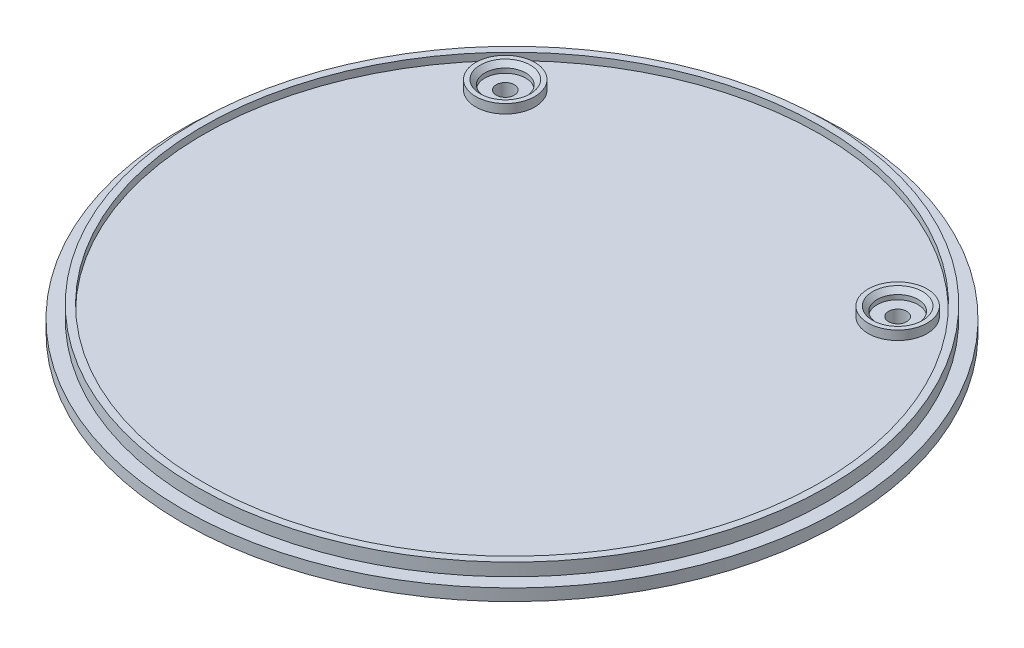
ISO-10303-21;
HEADER;
FILE_DESCRIPTION(('STEP AP214'),'2;1');
FILE_NAME('part.step','',(''),(''),'','','');
FILE_SCHEMA(('AUTOMOTIVE_DESIGN { 1 0 10303 214 1 1 1 1 }'));
ENDSEC;
DATA;
#1=APPLICATION_CONTEXT('core data for automotive mechanical design processes');
#2=APPLICATION_PROTOCOL_DEFINITION('international standard','automotive_design',2000,#1);
#3=PRODUCT_CONTEXT('',#1,'mechanical');
#4=PRODUCT('Part','Part','',(#3));
#5=PRODUCT_RELATED_PRODUCT_CATEGORY('part','',(#4));
#6=PRODUCT_DEFINITION_FORMATION('','',#4);
#7=PRODUCT_DEFINITION_CONTEXT('part definition',#1,'design');
#8=PRODUCT_DEFINITION('design','',#6,#7);
#9=PRODUCT_DEFINITION_SHAPE('','',#8);
#10=(LENGTH_UNIT() NAMED_UNIT(*) SI_UNIT(.MILLI.,.METRE.));
#11=(NAMED_UNIT(*) PLANE_ANGLE_UNIT() SI_UNIT($,.RADIAN.));
#12=(NAMED_UNIT(*) SI_UNIT($,.STERADIAN.) SOLID_ANGLE_UNIT());
#13=UNCERTAINTY_MEASURE_WITH_UNIT(LENGTH_MEASURE(1.E-05),#10,'distance_accuracy_value','');
#14=(GEOMETRIC_REPRESENTATION_CONTEXT(3) GLOBAL_UNCERTAINTY_ASSIGNED_CONTEXT((#13)) GLOBAL_UNIT_ASSIGNED_CONTEXT((#10,
#11,#12)) REPRESENTATION_CONTEXT('',''));
#15=CARTESIAN_POINT('',(0.,0.,0.));
#16=DIRECTION('',(0.,0.,1.));
#17=DIRECTION('',(1.,0.,0.));
#18=AXIS2_PLACEMENT_3D('',#15,#16,#17);
#19=CARTESIAN_POINT('',(-3.34981279583818E-06,-0.654452162270416,0.0664482039365306));
#20=DIRECTION('',(0.,1.,0.));
#21=DIRECTION('',(0.,0.,1.));
#22=AXIS2_PLACEMENT_3D('',#19,#20,#21);
#23=PLANE('',#22);
#24=CARTESIAN_POINT('',(-3.34981279583818E-06,-0.654452162270416,0.0664482039365306));
#25=DIRECTION('',(0.,1.,0.));
#26=DIRECTION('',(0.,0.,1.));
#27=AXIS2_PLACEMENT_3D('',#24,#25,#26);
#28=CIRCLE('',#27,33.);
#29=CARTESIAN_POINT('',(-3.34981279583818E-06,-0.654452162270416,33.0664482039365));
#30=VERTEX_POINT('',#29);
#31=EDGE_CURVE('E146',#30,#30,#28,.T.);
#32=ORIENTED_EDGE('',*,*,#31,.F.);
#33=EDGE_LOOP('',(#32));
#34=FACE_BOUND('',#33,.T.);
#35=ADVANCED_FACE('F34',(#34),#23,.F.);
#36=CARTESIAN_POINT('',(-3.34981279583818E-06,-1.65445216227042,0.0664482039365306));
#37=DIRECTION('',(0.,1.,0.));
#38=DIRECTION('',(0.,0.,1.));
#39=AXIS2_PLACEMENT_3D('',#36,#37,#38);
#40=CYLINDRICAL_SURFACE('',#39,33.);
#41=CARTESIAN_POINT('',(-3.34981279583818E-06,-1.65445216227031,0.0664482039365306));
#42=DIRECTION('',(0.,-1.,0.));
#43=DIRECTION('',(0.,0.,-1.));
#44=AXIS2_PLACEMENT_3D('',#41,#42,#43);
#45=CIRCLE('',#44,33.);
#46=CARTESIAN_POINT('',(-3.34981279583818E-06,-1.65445216227042,-32.9335517960635));
#47=VERTEX_POINT('',#46);
#48=EDGE_CURVE('E87',#47,#47,#45,.F.);
#49=ORIENTED_EDGE('',*,*,#48,.F.);
#50=EDGE_LOOP('',(#49));
#51=FACE_BOUND('',#50,.T.);
#52=ORIENTED_EDGE('',*,*,#31,.T.);
#53=EDGE_LOOP('',(#52));
#54=FACE_BOUND('',#53,.T.);
#55=ADVANCED_FACE('F131',(#51,#54),#40,.F.);
#56=CARTESIAN_POINT('',(-3.35033781592562E-06,-1.11936322633818,-68.4501471784258));
#57=CARTESIAN_POINT('',(-3.35033781590829E-06,-1.338600230619,-68.73318093391));
#58=CARTESIAN_POINT('',(-3.35033781588755E-06,-1.45445216243666,-69.071930547465));
#59=CARTESIAN_POINT('',(-3.35033781586563E-06,-1.45445216227041,-69.4299430762815));
#60=(BOUNDED_CURVE() B_SPLINE_CURVE(3,(#56,#57,#58,#59),.UNSPECIFIED.,.F.,
.F.) B_SPLINE_CURVE_WITH_KNOTS((4,4),(0.,1.),
.UNSPECIFIED.) CURVE() GEOMETRIC_REPRESENTATION_ITEM() RATIONAL_B_SPLINE_CURVE((1.,
0.964129904654601,0.964129904654601,1.)) REPRESENTATION_ITEM(''));
#61=CARTESIAN_POINT('',(-3.34981279583818E-06,0.145547837729584,0.0664482039365306));
#62=DIRECTION('',(0.,-1.,0.));
#63=AXIS1_PLACEMENT('',#61,#62);
#64=SURFACE_OF_REVOLUTION('',#60,#63);
#65=CARTESIAN_POINT('',(-3.34981279583818E-06,-1.11936322629599,0.0664482039365306));
#66=DIRECTION('',(0.,-1.,0.));
#67=DIRECTION('',(0.,0.,-1.));
#68=AXIS2_PLACEMENT_3D('',#65,#66,#67);
#69=CIRCLE('',#68,68.5165953820329);
#70=CARTESIAN_POINT('',(-3.34981279583818E-06,-1.1193632262959,-68.4501471780963));
#71=VERTEX_POINT('',#70);
#72=EDGE_CURVE('E144',#71,#71,#69,.T.);
#73=ORIENTED_EDGE('',*,*,#72,.F.);
#74=EDGE_LOOP('',(#73));
#75=FACE_BOUND('',#74,.T.);
#76=CARTESIAN_POINT('',(-3.34981279583818E-06,-1.45445216227041,0.0664482039365306));
#77=DIRECTION('',(0.,-1.,0.));
#78=DIRECTION('',(-7.55463726655256E-12,0.,-1.));
#79=AXIS2_PLACEMENT_3D('',#76,#77,#78);
#80=CIRCLE('',#79,69.4963912797375);
#81=CARTESIAN_POINT('',(-3.34949758373782E-06,-1.45445216227042,69.5628394837791));
#82=VERTEX_POINT('',#81);
#83=CARTESIAN_POINT('',(-3.35012799579841E-06,-1.45445216227042,-69.429943075906));
#84=VERTEX_POINT('',#83);
#85=EDGE_CURVE('E76',#82,#84,#80,.F.);
#86=ORIENTED_EDGE('',*,*,#85,.F.);
#87=CARTESIAN_POINT('',(-3.34981279583818E-06,-1.45445216227041,0.0664482039365306));
#88=DIRECTION('',(0.,-1.,0.));
#89=DIRECTION('',(7.55475973123465E-12,0.,1.));
#90=AXIS2_PLACEMENT_3D('',#87,#88,#89);
#91=CIRCLE('',#90,69.4963912797375);
#92=EDGE_CURVE('E74',#84,#82,#91,.F.);
#93=ORIENTED_EDGE('',*,*,#92,.F.);
#94=EDGE_LOOP('',(#86,#93));
#95=FACE_BOUND('',#94,.T.);
#96=ADVANCED_FACE('F78',(#75,#95),#64,.F.);
#97=CARTESIAN_POINT('',(-3.34981279583818E-06,-0.928245010270416,0.0664482039365306));
#98=DIRECTION('',(0.,-1.,0.));
#99=DIRECTION('',(0.,0.,-1.));
#100=AXIS2_PLACEMENT_3D('',#97,#98,#99);
#101=CONICAL_SURFACE('',#100,68.269862828,0.91173828722413);
#102=ORIENTED_EDGE('',*,*,#72,.T.);
#103=EDGE_LOOP('',(#102));
#104=FACE_BOUND('',#103,.T.);
#105=CARTESIAN_POINT('',(-3.34981279583818E-06,-0.928245011376177,0.0664482039365306));
#106=DIRECTION('',(0.,1.,0.));
#107=DIRECTION('',(-8.24364362223133E-12,0.,1.));
#108=AXIS2_PLACEMENT_3D('',#105,#106,#107);
#109=CIRCLE('',#108,68.2698628277938);
#110=CARTESIAN_POINT('',(-3.35037558825747E-06,-0.928245011376177,68.3363110317303));
#111=VERTEX_POINT('',#110);
#112=EDGE_CURVE('E81',#111,#111,#109,.F.);
#113=ORIENTED_EDGE('',*,*,#112,.F.);
#114=EDGE_LOOP('',(#113));
#115=FACE_BOUND('',#114,.T.);
#116=ADVANCED_FACE('F130',(#104,#115),#101,.F.);
#117=CARTESIAN_POINT('',(-3.34981279583818E-06,-1.65445216227042,0.0664482039365306));
#118=DIRECTION('',(0.,-1.,0.));
#119=DIRECTION('',(0.,0.,-1.));
#120=AXIS2_PLACEMENT_3D('',#117,#118,#119);
#121=CONICAL_SURFACE('',#120,33.,0.785398163397449);
#122=ORIENTED_EDGE('',*,*,#48,.T.);
#123=EDGE_LOOP('',(#122));
#124=FACE_BOUND('',#123,.T.);
#125=CARTESIAN_POINT('',(-3.34981279583818E-06,-3.65445216227053,0.0664482039365306));
#126=DIRECTION('',(0.,-1.,0.));
#127=DIRECTION('',(0.,0.,-1.));
#128=AXIS2_PLACEMENT_3D('',#125,#126,#127);
#129=CIRCLE('',#128,35.0000000000001);
#130=CARTESIAN_POINT('',(-3.34981279583818E-06,-3.65445216227053,-34.9335517960636));
#131=VERTEX_POINT('',#130);
#132=EDGE_CURVE('E121',#131,#131,#129,.F.);
#133=ORIENTED_EDGE('',*,*,#132,.F.);
#134=EDGE_LOOP('',(#133));
#135=FACE_BOUND('',#134,.T.);
#136=ADVANCED_FACE('F108',(#124,#135),#121,.F.);
#137=CARTESIAN_POINT('',(-3.34981279583818E-06,-1.45445216227042,0.0664482039365306));
#138=DIRECTION('',(0.,-1.,0.));
#139=DIRECTION('',(0.,0.,-1.));
#140=AXIS2_PLACEMENT_3D('',#137,#138,#139);
#141=PLANE('',#140);
#142=ORIENTED_EDGE('',*,*,#92,.T.);
#143=ORIENTED_EDGE('',*,*,#85,.T.);
#144=EDGE_LOOP('',(#142,#143));
#145=FACE_BOUND('',#144,.T.);
#146=CARTESIAN_POINT('',(-3.34981279583818E-06,-1.45445216227042,0.0664482039365306));
#147=DIRECTION('',(0.,-1.,0.));
#148=DIRECTION('',(0.,0.,-1.));
#149=AXIS2_PLACEMENT_3D('',#146,#147,#148);
#150=CIRCLE('',#149,72.5);
#151=CARTESIAN_POINT('',(-3.34981279583818E-06,-1.45445216227042,-72.4335517960635));
#152=VERTEX_POINT('',#151);
#153=EDGE_CURVE('E209',#152,#152,#150,.F.);
#154=ORIENTED_EDGE('',*,*,#153,.F.);
#155=EDGE_LOOP('',(#154));
#156=FACE_BOUND('',#155,.T.);
#157=ADVANCED_FACE('F85',(#145,#156),#141,.T.);
#158=CARTESIAN_POINT('',(-3.35037558825747E-06,-0.928245010637319,68.3363110307764));
#159=CARTESIAN_POINT('',(-3.35037558824866E-06,-0.816790401305734,68.1924237488433));
#160=CARTESIAN_POINT('',(-3.35037558824113E-06,-0.682622841913765,68.069441043351));
#161=CARTESIAN_POINT('',(-3.35037558823509E-06,-0.529601740217797,67.9709005832388));
#162=(BOUNDED_CURVE() B_SPLINE_CURVE(3,(#158,#159,#160,#161),.UNSPECIFIED.,.F.,
.F.) B_SPLINE_CURVE_WITH_KNOTS((4,4),(0.,1.),
.UNSPECIFIED.) CURVE() GEOMETRIC_REPRESENTATION_ITEM() RATIONAL_B_SPLINE_CURVE((1.,
0.990411473101553,0.990411473101553,1.)) REPRESENTATION_ITEM(''));
#163=CARTESIAN_POINT('',(-3.34981279583818E-06,0.336666053729584,0.0664482039365306));
#164=DIRECTION('',(0.,1.,0.));
#165=AXIS1_PLACEMENT('',#163,#164);
#166=SURFACE_OF_REVOLUTION('',#162,#165);
#167=CARTESIAN_POINT('',(-3.34981279583818E-06,-0.529601740197338,0.0664482039365306));
#168=DIRECTION('',(0.,-1.,0.));
#169=DIRECTION('',(0.,0.,-1.));
#170=AXIS2_PLACEMENT_3D('',#167,#168,#169);
#171=CIRCLE('',#170,67.9044523795949);
#172=CARTESIAN_POINT('',(-3.34981279586907E-06,-0.529601740197338,-67.8380041756583));
#173=VERTEX_POINT('',#172);
#174=EDGE_CURVE('E212',#173,#173,#171,.T.);
#175=ORIENTED_EDGE('',*,*,#174,.F.);
#176=EDGE_LOOP('',(#175));
#177=FACE_BOUND('',#176,.T.);
#178=ORIENTED_EDGE('',*,*,#112,.T.);
#179=EDGE_LOOP('',(#178));
#180=FACE_BOUND('',#179,.T.);
#181=ADVANCED_FACE('F107',(#177,#180),#166,.F.);
#182=CARTESIAN_POINT('',(-3.34981279583818E-06,-3.65445216227042,0.0664482039365306));
#183=DIRECTION('',(0.,-1.,0.));
#184=DIRECTION('',(0.,0.,-1.));
#185=AXIS2_PLACEMENT_3D('',#182,#183,#184);
#186=PLANE('',#185);
#187=ORIENTED_EDGE('',*,*,#132,.T.);
#188=EDGE_LOOP('',(#187));
#189=FACE_BOUND('',#188,.T.);
#190=CARTESIAN_POINT('',(-3.34981279583818E-06,-3.65445216227042,0.0664482039365306));
#191=DIRECTION('',(0.,1.,0.));
#192=DIRECTION('',(0.,0.,1.));
#193=AXIS2_PLACEMENT_3D('',#190,#191,#192);
#194=CIRCLE('',#193,37.4);
#195=CARTESIAN_POINT('',(-3.3498128942334E-06,-3.65445216227041,37.4664482039366));
#196=VERTEX_POINT('',#195);
#197=CARTESIAN_POINT('',(-3.3498126909443E-06,-3.65445216227041,-37.3335517960635));
#198=VERTEX_POINT('',#197);
#199=EDGE_CURVE('E354',#196,#198,#194,.T.);
#200=ORIENTED_EDGE('',*,*,#199,.F.);
#201=CARTESIAN_POINT('',(-3.34981279583818E-06,-3.65445216227042,0.0664482039365306));
#202=DIRECTION('',(0.,1.,0.));
#203=DIRECTION('',(0.,0.,-1.));
#204=AXIS2_PLACEMENT_3D('',#201,#202,#203);
#205=CIRCLE('',#204,37.4);
#206=EDGE_CURVE('E208',#198,#196,#205,.T.);
#207=ORIENTED_EDGE('',*,*,#206,.F.);
#208=EDGE_LOOP('',(#200,#207));
#209=FACE_BOUND('',#208,.T.);
#210=ADVANCED_FACE('F360',(#189,#209),#186,.T.);
#211=CARTESIAN_POINT('',(-3.34981279583818E-06,-1.45445216227042,0.0664482039365306));
#212=DIRECTION('',(0.,-1.,0.));
#213=DIRECTION('',(0.,0.,-1.));
#214=AXIS2_PLACEMENT_3D('',#211,#212,#213);
#215=CYLINDRICAL_SURFACE('',#214,72.5);
#216=ORIENTED_EDGE('',*,*,#153,.T.);
#217=EDGE_LOOP('',(#216));
#218=FACE_BOUND('',#217,.T.);
#219=CARTESIAN_POINT('',(-3.34981279583818E-06,1.14554783772958,0.0664482039365306));
#220=DIRECTION('',(0.,-1.,0.));
#221=DIRECTION('',(0.,0.,-1.));
#222=AXIS2_PLACEMENT_3D('',#219,#220,#221);
#223=CIRCLE('',#222,72.5);
#224=CARTESIAN_POINT('',(-3.34981279583818E-06,1.14554783772958,-72.4335517960635));
#225=VERTEX_POINT('',#224);
#226=EDGE_CURVE('E204',#225,#225,#223,.F.);
#227=ORIENTED_EDGE('',*,*,#226,.F.);
#228=EDGE_LOOP('',(#227));
#229=FACE_BOUND('',#228,.T.);
#230=ADVANCED_FACE('F368',(#218,#229),#215,.T.);
#231=CARTESIAN_POINT('',(-3.34981279583818E-06,-0.254452162270416,-67.3335517960635));
#232=CARTESIAN_POINT('',(-3.34981279585094E-06,-0.254452162270416,-67.5420619954351));
#233=CARTESIAN_POINT('',(-3.34981279586215E-06,-0.354295963309176,-67.725113132105));
#234=CARTESIAN_POINT('',(-3.34981279586907E-06,-0.529601740433404,-67.8380041758104));
#235=(BOUNDED_CURVE() B_SPLINE_CURVE(3,(#231,#232,#233,#234),.UNSPECIFIED.,.F.,
.F.) B_SPLINE_CURVE_WITH_KNOTS((4,4),(0.,1.),
.UNSPECIFIED.) CURVE() GEOMETRIC_REPRESENTATION_ITEM() RATIONAL_B_SPLINE_CURVE((1.,
0.91860010436426,0.91860010436426,1.)) REPRESENTATION_ITEM(''));
#236=CARTESIAN_POINT('',(-3.34981279583818E-06,-0.854452162270416,0.0664482039365306));
#237=DIRECTION('',(0.,-1.,0.));
#238=AXIS1_PLACEMENT('',#236,#237);
#239=SURFACE_OF_REVOLUTION('',#235,#238);
#240=ORIENTED_EDGE('',*,*,#174,.T.);
#241=EDGE_LOOP('',(#240));
#242=FACE_BOUND('',#241,.T.);
#243=CARTESIAN_POINT('',(-3.34981279583818E-06,-0.254452162270416,0.0664482039365306));
#244=DIRECTION('',(0.,1.,0.));
#245=DIRECTION('',(0.,0.,-1.));
#246=AXIS2_PLACEMENT_3D('',#243,#244,#245);
#247=CIRCLE('',#246,67.4);
#248=CARTESIAN_POINT('',(-3.34981297316006E-06,-0.254452162270415,67.4664482039365));
#249=VERTEX_POINT('',#248);
#250=CARTESIAN_POINT('',(-3.34981260675609E-06,-0.254452162270415,-67.3335517960635));
#251=VERTEX_POINT('',#250);
#252=EDGE_CURVE('E203',#249,#251,#247,.F.);
#253=ORIENTED_EDGE('',*,*,#252,.F.);
#254=CARTESIAN_POINT('',(-3.34981279583818E-06,-0.254452162270416,0.0664482039365306));
#255=DIRECTION('',(0.,1.,0.));
#256=DIRECTION('',(0.,0.,1.));
#257=AXIS2_PLACEMENT_3D('',#254,#255,#256);
#258=CIRCLE('',#257,67.4);
#259=EDGE_CURVE('E207',#251,#249,#258,.F.);
#260=ORIENTED_EDGE('',*,*,#259,.F.);
#261=EDGE_LOOP('',(#253,#260));
#262=FACE_BOUND('',#261,.T.);
#263=ADVANCED_FACE('F316',(#242,#262),#239,.F.);
#264=CARTESIAN_POINT('',(-3.34981279583818E-06,-3.65445216227042,-37.3335517960635));
#265=CARTESIAN_POINT('',(-3.34981279578079E-06,-3.6544521622704,-38.2708100962665));
#266=CARTESIAN_POINT('',(-3.3498127957402E-06,-2.99171046247345,-38.9335517960635));
#267=CARTESIAN_POINT('',(-3.3498127957402E-06,-2.05445216227042,-38.9335517960635));
#268=(BOUNDED_CURVE() B_SPLINE_CURVE(3,(#264,#265,#266,#267),.UNSPECIFIED.,.F.,
.F.) B_SPLINE_CURVE_WITH_KNOTS((4,4),(0.,1.),
.UNSPECIFIED.) CURVE() GEOMETRIC_REPRESENTATION_ITEM() RATIONAL_B_SPLINE_CURVE((1.,
0.804737854124368,0.804737854124368,1.)) REPRESENTATION_ITEM(''));
#269=CARTESIAN_POINT('',(-3.34981279583818E-06,-2.05445216227042,0.0664482039365306));
#270=DIRECTION('',(0.,-1.,0.));
#271=AXIS1_PLACEMENT('',#269,#270);
#272=SURFACE_OF_REVOLUTION('',#268,#271);
#273=CARTESIAN_POINT('',(-3.34981279583818E-06,-2.05445216227042,0.0664482039365306));
#274=DIRECTION('',(0.,1.,0.));
#275=DIRECTION('',(0.,0.,1.));
#276=AXIS2_PLACEMENT_3D('',#273,#274,#275);
#277=CIRCLE('',#276,39.);
#278=CARTESIAN_POINT('',(-3.34981279583818E-06,-2.05445216227042,39.0664482039365));
#279=VERTEX_POINT('',#278);
#280=EDGE_CURVE('E199',#279,#279,#277,.T.);
#281=ORIENTED_EDGE('',*,*,#280,.F.);
#282=EDGE_LOOP('',(#281));
#283=FACE_BOUND('',#282,.T.);
#284=ORIENTED_EDGE('',*,*,#206,.T.);
#285=ORIENTED_EDGE('',*,*,#199,.T.);
#286=EDGE_LOOP('',(#284,#285));
#287=FACE_BOUND('',#286,.T.);
#288=ADVANCED_FACE('F311',(#283,#287),#272,.F.);
#289=CARTESIAN_POINT('',(-3.34981279583818E-06,1.14554783772958,0.0664482039365306));
#290=DIRECTION('',(0.,1.,0.));
#291=DIRECTION('',(0.,0.,1.));
#292=AXIS2_PLACEMENT_3D('',#289,#290,#291);
#293=PLANE('',#292);
#294=CARTESIAN_POINT('',(-3.34981279583818E-06,1.14554783772958,0.0664482039365306));
#295=DIRECTION('',(0.,1.,0.));
#296=DIRECTION('',(0.,0.,1.));
#297=AXIS2_PLACEMENT_3D('',#294,#295,#296);
#298=CIRCLE('',#297,69.5);
#299=CARTESIAN_POINT('',(-3.34981279583818E-06,1.14554783772958,69.5664482039365));
#300=VERTEX_POINT('',#299);
#301=EDGE_CURVE('E196',#300,#300,#298,.T.);
#302=ORIENTED_EDGE('',*,*,#301,.F.);
#303=EDGE_LOOP('',(#302));
#304=FACE_BOUND('',#303,.T.);
#305=ORIENTED_EDGE('',*,*,#226,.T.);
#306=EDGE_LOOP('',(#305));
#307=FACE_BOUND('',#306,.T.);
#308=ADVANCED_FACE('F315',(#304,#307),#293,.T.);
#309=CARTESIAN_POINT('',(-43.1603913698128,3.34554783772958,-41.6130540240635));
#310=DIRECTION('',(0.,-1.,0.));
#311=DIRECTION('',(0.,0.,-1.));
#312=AXIS2_PLACEMENT_3D('',#309,#310,#311);
#313=CYLINDRICAL_SURFACE('',#312,4.49999999999999);
#314=CARTESIAN_POINT('',(-43.1603913698128,3.34554783710964,-41.6130540240635));
#315=DIRECTION('',(0.,1.,0.));
#316=DIRECTION('',(0.,0.,1.));
#317=AXIS2_PLACEMENT_3D('',#314,#315,#316);
#318=CIRCLE('',#317,4.49999999938015);
#319=CARTESIAN_POINT('',(-43.1603913698128,3.34554783710972,-37.1130540246833));
#320=VERTEX_POINT('',#319);
#321=EDGE_CURVE('E195',#320,#320,#318,.F.);
#322=ORIENTED_EDGE('',*,*,#321,.F.);
#323=EDGE_LOOP('',(#322));
#324=FACE_BOUND('',#323,.T.);
#325=CARTESIAN_POINT('',(-43.1603913698128,2.3455478381898,-41.6130540240635));
#326=DIRECTION('',(0.,-1.,0.));
#327=DIRECTION('',(0.,0.,-1.));
#328=AXIS2_PLACEMENT_3D('',#325,#326,#327);
#329=CIRCLE('',#328,4.49999999999999);
#330=CARTESIAN_POINT('',(-43.1603913698128,2.3455478381898,-46.1130540240635));
#331=VERTEX_POINT('',#330);
#332=EDGE_CURVE('E200',#331,#331,#329,.F.);
#333=ORIENTED_EDGE('',*,*,#332,.F.);
#334=EDGE_LOOP('',(#333));
#335=FACE_BOUND('',#334,.T.);
#336=ADVANCED_FACE('F282',(#324,#335),#313,.F.);
#337=CARTESIAN_POINT('',(-3.34981279583818E-06,-0.254452162270416,0.0664482039365306));
#338=DIRECTION('',(0.,-1.,0.));
#339=DIRECTION('',(0.,0.,-1.));
#340=AXIS2_PLACEMENT_3D('',#337,#338,#339);
#341=PLANE('',#340);
#342=CARTESIAN_POINT('',(-3.34981279583818E-06,-0.254452162270416,0.0664482039365306));
#343=DIRECTION('',(0.,-1.,0.));
#344=DIRECTION('',(0.,0.,-1.));
#345=AXIS2_PLACEMENT_3D('',#342,#343,#344);
#346=CIRCLE('',#345,64.);
#347=CARTESIAN_POINT('',(-3.34981279583818E-06,-0.254452162270416,-63.9335517960635));
#348=VERTEX_POINT('',#347);
#349=EDGE_CURVE('E192',#348,#348,#346,.T.);
#350=ORIENTED_EDGE('',*,*,#349,.F.);
#351=EDGE_LOOP('',(#350));
#352=FACE_BOUND('',#351,.T.);
#353=ORIENTED_EDGE('',*,*,#259,.T.);
#354=ORIENTED_EDGE('',*,*,#252,.T.);
#355=EDGE_LOOP('',(#353,#354));
#356=FACE_BOUND('',#355,.T.);
#357=ADVANCED_FACE('F271',(#352,#356),#341,.T.);
#358=CARTESIAN_POINT('',(-3.34981279583818E-06,2.34554783772958,0.0664482039365306));
#359=DIRECTION('',(0.,1.,0.));
#360=DIRECTION('',(0.,0.,1.));
#361=AXIS2_PLACEMENT_3D('',#358,#359,#360);
#362=PLANE('',#361);
#363=CARTESIAN_POINT('',(-43.1603913698128,2.34554783726937,-41.6130540240635));
#364=DIRECTION('',(0.,1.,0.));
#365=DIRECTION('',(0.,0.,1.));
#366=AXIS2_PLACEMENT_3D('',#363,#364,#365);
#367=CIRCLE('',#366,2.);
#368=CARTESIAN_POINT('',(-43.1603913698128,2.34554783726937,-39.6130540240635));
#369=VERTEX_POINT('',#368);
#370=EDGE_CURVE('E189',#369,#369,#367,.T.);
#371=ORIENTED_EDGE('',*,*,#370,.F.);
#372=EDGE_LOOP('',(#371));
#373=FACE_BOUND('',#372,.T.);
#374=ORIENTED_EDGE('',*,*,#332,.T.);
#375=EDGE_LOOP('',(#374));
#376=FACE_BOUND('',#375,.T.);
#377=ADVANCED_FACE('F281',(#373,#376),#362,.T.);
#378=CARTESIAN_POINT('',(-3.34981279583818E-06,-1.25445216227042,0.0664482039365306));
#379=DIRECTION('',(0.,1.,0.));
#380=DIRECTION('',(0.,0.,1.));
#381=AXIS2_PLACEMENT_3D('',#378,#379,#380);
#382=CYLINDRICAL_SURFACE('',#381,39.);
#383=ORIENTED_EDGE('',*,*,#280,.T.);
#384=EDGE_LOOP('',(#383));
#385=FACE_BOUND('',#384,.T.);
#386=CARTESIAN_POINT('',(-3.34981279583818E-06,-1.25445216227041,0.0664482039365306));
#387=DIRECTION('',(0.,1.,0.));
#388=DIRECTION('',(0.,0.,1.));
#389=AXIS2_PLACEMENT_3D('',#386,#387,#388);
#390=CIRCLE('',#389,39.);
#391=CARTESIAN_POINT('',(-3.34981279587492E-06,-1.25445216227041,39.0664482039365));
#392=VERTEX_POINT('',#391);
#393=EDGE_CURVE('E188',#392,#392,#390,.T.);
#394=ORIENTED_EDGE('',*,*,#393,.F.);
#395=EDGE_LOOP('',(#394));
#396=FACE_BOUND('',#395,.T.);
#397=ADVANCED_FACE('F470',(#385,#396),#382,.T.);
#398=CARTESIAN_POINT('',(-3.34981279583818E-06,3.94554783772958,0.0664482039365306));
#399=DIRECTION('',(0.,1.,0.));
#400=DIRECTION('',(0.,0.,1.));
#401=AXIS2_PLACEMENT_3D('',#398,#399,#400);
#402=CYLINDRICAL_SURFACE('',#401,69.5);
#403=ORIENTED_EDGE('',*,*,#301,.T.);
#404=EDGE_LOOP('',(#403));
#405=FACE_BOUND('',#404,.T.);
#406=CARTESIAN_POINT('',(-3.34981279583818E-06,3.94554783772958,0.0664482039365306));
#407=DIRECTION('',(0.,1.,0.));
#408=DIRECTION('',(0.,0.,1.));
#409=AXIS2_PLACEMENT_3D('',#406,#407,#408);
#410=CIRCLE('',#409,69.5);
#411=CARTESIAN_POINT('',(-3.34981279583818E-06,3.94554783772958,69.5664482039365));
#412=VERTEX_POINT('',#411);
#413=EDGE_CURVE('E185',#412,#412,#410,.T.);
#414=ORIENTED_EDGE('',*,*,#413,.F.);
#415=EDGE_LOOP('',(#414));
#416=FACE_BOUND('',#415,.T.);
#417=ADVANCED_FACE('F465',(#405,#416),#402,.T.);
#418=CARTESIAN_POINT('',(-43.1603913698128,3.34554783772958,-41.6130540240635));
#419=DIRECTION('',(0.,1.,0.));
#420=DIRECTION('',(0.,0.,1.));
#421=AXIS2_PLACEMENT_3D('',#418,#419,#420);
#422=CONICAL_SURFACE('',#421,4.50000000000001,0.785398163397449);
#423=ORIENTED_EDGE('',*,*,#321,.T.);
#424=EDGE_LOOP('',(#423));
#425=FACE_BOUND('',#424,.T.);
#426=CARTESIAN_POINT('',(-43.1603913698128,4.34554783803057,-41.6130540240635));
#427=DIRECTION('',(0.,1.,0.));
#428=DIRECTION('',(0.,0.,1.));
#429=AXIS2_PLACEMENT_3D('',#426,#427,#428);
#430=CIRCLE('',#429,5.500000000301);
#431=CARTESIAN_POINT('',(-43.1603913698128,4.34554783803057,-36.1130540237625));
#432=VERTEX_POINT('',#431);
#433=EDGE_CURVE('E182',#432,#432,#430,.F.);
#434=ORIENTED_EDGE('',*,*,#433,.F.);
#435=EDGE_LOOP('',(#434));
#436=FACE_BOUND('',#435,.T.);
#437=ADVANCED_FACE('F458',(#425,#436),#422,.F.);
#438=CARTESIAN_POINT('',(-3.34981279583818E-06,-0.654452162270416,0.0664482039365306));
#439=DIRECTION('',(0.,-1.,0.));
#440=DIRECTION('',(0.,0.,-1.));
#441=AXIS2_PLACEMENT_3D('',#438,#439,#440);
#442=CYLINDRICAL_SURFACE('',#441,64.);
#443=ORIENTED_EDGE('',*,*,#349,.T.);
#444=EDGE_LOOP('',(#443));
#445=FACE_BOUND('',#444,.T.);
#446=CARTESIAN_POINT('',(-3.34981279583818E-06,-0.654452162270416,0.0664482039365306));
#447=DIRECTION('',(0.,-1.,0.));
#448=DIRECTION('',(0.,0.,-1.));
#449=AXIS2_PLACEMENT_3D('',#446,#447,#448);
#450=CIRCLE('',#449,64.);
#451=CARTESIAN_POINT('',(-3.34981279583818E-06,-0.654452162270416,-63.9335517960635));
#452=VERTEX_POINT('',#451);
#453=EDGE_CURVE('E179',#452,#452,#450,.T.);
#454=ORIENTED_EDGE('',*,*,#453,.F.);
#455=EDGE_LOOP('',(#454));
#456=FACE_BOUND('',#455,.T.);
#457=ADVANCED_FACE('F456',(#445,#456),#442,.T.);
#458=CARTESIAN_POINT('',(-43.1603913698128,-0.654452162270416,-41.6130540240635));
#459=DIRECTION('',(0.,1.,0.));
#460=DIRECTION('',(0.,0.,1.));
#461=AXIS2_PLACEMENT_3D('',#458,#459,#460);
#462=CYLINDRICAL_SURFACE('',#461,2.);
#463=ORIENTED_EDGE('',*,*,#370,.T.);
#464=EDGE_LOOP('',(#463));
#465=FACE_BOUND('',#464,.T.);
#466=CARTESIAN_POINT('',(-43.1603913698128,-0.654452162730628,-41.6130540240635));
#467=DIRECTION('',(0.,1.,0.));
#468=DIRECTION('',(0.,0.,1.));
#469=AXIS2_PLACEMENT_3D('',#466,#467,#468);
#470=CIRCLE('',#469,2.);
#471=CARTESIAN_POINT('',(-43.1603913698128,-0.654452162730628,-39.6130540240635));
#472=VERTEX_POINT('',#471);
#473=EDGE_CURVE('E175',#472,#472,#470,.T.);
#474=ORIENTED_EDGE('',*,*,#473,.F.);
#475=EDGE_LOOP('',(#474));
#476=FACE_BOUND('',#475,.T.);
#477=ADVANCED_FACE('F235',(#465,#476),#462,.F.);
#478=CARTESIAN_POINT('',(-3.34981279583818E-06,-0.654452162270415,39.6664482039365));
#479=CARTESIAN_POINT('',(-3.3498127958597E-06,-0.654452162270411,39.3149763413604));
#480=CARTESIAN_POINT('',(-3.34981279587492E-06,-0.902980299694265,39.0664482039365));
#481=CARTESIAN_POINT('',(-3.34981279587492E-06,-1.25445216227041,39.0664482039365));
#482=(BOUNDED_CURVE() B_SPLINE_CURVE(3,(#478,#479,#480,#481),.UNSPECIFIED.,.F.,
.F.) B_SPLINE_CURVE_WITH_KNOTS((4,4),(0.,1.),
.UNSPECIFIED.) CURVE() GEOMETRIC_REPRESENTATION_ITEM() RATIONAL_B_SPLINE_CURVE((1.,
0.804737854124365,0.804737854124365,1.)) REPRESENTATION_ITEM(''));
#483=CARTESIAN_POINT('',(-3.34981279583818E-06,-1.25445216227042,0.0664482039365306));
#484=DIRECTION('',(0.,1.,0.));
#485=AXIS1_PLACEMENT('',#483,#484);
#486=SURFACE_OF_REVOLUTION('',#482,#485);
#487=ORIENTED_EDGE('',*,*,#393,.T.);
#488=EDGE_LOOP('',(#487));
#489=FACE_BOUND('',#488,.T.);
#490=CARTESIAN_POINT('',(-3.34981279583818E-06,-0.654452162270415,0.0664482039365306));
#491=DIRECTION('',(0.,-1.,0.));
#492=DIRECTION('',(0.,0.,1.));
#493=AXIS2_PLACEMENT_3D('',#490,#491,#492);
#494=CIRCLE('',#493,39.6);
#495=CARTESIAN_POINT('',(-3.34981290002136E-06,-0.654452162270416,-39.5335517960635));
#496=VERTEX_POINT('',#495);
#497=CARTESIAN_POINT('',(-3.34981268474309E-06,-0.654452162270416,39.6664482039365));
#498=VERTEX_POINT('',#497);
#499=EDGE_CURVE('E53',#496,#498,#494,.F.);
#500=ORIENTED_EDGE('',*,*,#499,.F.);
#501=CARTESIAN_POINT('',(-3.34981279583818E-06,-0.654452162270415,0.0664482039365306));
#502=DIRECTION('',(0.,-1.,0.));
#503=DIRECTION('',(0.,0.,-1.));
#504=AXIS2_PLACEMENT_3D('',#501,#502,#503);
#505=CIRCLE('',#504,39.6);
#506=EDGE_CURVE('E178',#498,#496,#505,.F.);
#507=ORIENTED_EDGE('',*,*,#506,.F.);
#508=EDGE_LOOP('',(#500,#507));
#509=FACE_BOUND('',#508,.T.);
#510=ADVANCED_FACE('F223',(#489,#509),#486,.F.);
#511=CARTESIAN_POINT('',(-3.34981279583818E-06,3.94554783772958,0.0664482039365306));
#512=DIRECTION('',(0.,1.,0.));
#513=DIRECTION('',(0.,0.,1.));
#514=AXIS2_PLACEMENT_3D('',#511,#512,#513);
#515=PLANE('',#514);
#516=CARTESIAN_POINT('',(-3.34981279583818E-06,3.94554783772958,0.0664482039365306));
#517=DIRECTION('',(0.,-1.,0.));
#518=DIRECTION('',(0.,0.,-1.));
#519=AXIS2_PLACEMENT_3D('',#516,#517,#518);
#520=CIRCLE('',#519,67.9);
#521=CARTESIAN_POINT('',(-3.34981279583818E-06,3.94554783772958,-67.8335517960635));
#522=VERTEX_POINT('',#521);
#523=EDGE_CURVE('E172',#522,#522,#520,.F.);
#524=ORIENTED_EDGE('',*,*,#523,.F.);
#525=EDGE_LOOP('',(#524));
#526=FACE_BOUND('',#525,.T.);
#527=ORIENTED_EDGE('',*,*,#413,.T.);
#528=EDGE_LOOP('',(#527));
#529=FACE_BOUND('',#528,.T.);
#530=ADVANCED_FACE('F234',(#526,#529),#515,.T.);
#531=CARTESIAN_POINT('',(-3.34981279583818E-06,4.34554783772958,0.0664482039365306));
#532=DIRECTION('',(0.,1.,0.));
#533=DIRECTION('',(0.,0.,1.));
#534=AXIS2_PLACEMENT_3D('',#531,#532,#533);
#535=PLANE('',#534);
#536=ORIENTED_EDGE('',*,*,#433,.T.);
#537=EDGE_LOOP('',(#536));
#538=FACE_BOUND('',#537,.T.);
#539=CARTESIAN_POINT('',(-43.1603913698128,4.3455478381898,-41.6130540240635));
#540=DIRECTION('',(0.,-1.,0.));
#541=DIRECTION('',(0.,0.,-1.));
#542=AXIS2_PLACEMENT_3D('',#539,#540,#541);
#543=CIRCLE('',#542,6.49999999999999);
#544=CARTESIAN_POINT('',(-43.1603913698128,4.3455478381898,-48.1130540240635));
#545=VERTEX_POINT('',#544);
#546=EDGE_CURVE('E169',#545,#545,#543,.T.);
#547=ORIENTED_EDGE('',*,*,#546,.F.);
#548=EDGE_LOOP('',(#547));
#549=FACE_BOUND('',#548,.T.);
#550=ADVANCED_FACE('F436',(#538,#549),#535,.T.);
#551=CARTESIAN_POINT('',(-3.34981279583818E-06,-0.654452162270416,0.0664482039365306));
#552=DIRECTION('',(0.,1.,0.));
#553=DIRECTION('',(0.,0.,1.));
#554=AXIS2_PLACEMENT_3D('',#551,#552,#553);
#555=PLANE('',#554);
#556=ORIENTED_EDGE('',*,*,#506,.T.);
#557=ORIENTED_EDGE('',*,*,#499,.T.);
#558=EDGE_LOOP('',(#556,#557));
#559=FACE_BOUND('',#558,.T.);
#560=ORIENTED_EDGE('',*,*,#473,.T.);
#561=EDGE_LOOP('',(#560));
#562=FACE_BOUND('',#561,.T.);
#563=CARTESIAN_POINT('',(43.1603846701872,-0.654452162730628,-41.6130540240635));
#564=DIRECTION('',(0.,1.,0.));
#565=DIRECTION('',(0.,0.,1.));
#566=AXIS2_PLACEMENT_3D('',#563,#564,#565);
#567=CIRCLE('',#566,2.);
#568=CARTESIAN_POINT('',(43.1603846701872,-0.654452162730628,-39.6130540240635));
#569=VERTEX_POINT('',#568);
#570=EDGE_CURVE('E166',#569,#569,#567,.F.);
#571=ORIENTED_EDGE('',*,*,#570,.F.);
#572=EDGE_LOOP('',(#571));
#573=FACE_BOUND('',#572,.T.);
#574=ORIENTED_EDGE('',*,*,#453,.T.);
#575=EDGE_LOOP('',(#574));
#576=FACE_BOUND('',#575,.T.);
#577=ADVANCED_FACE('F432',(#559,#562,#573,#576),#555,.F.);
#578=CARTESIAN_POINT('',(-3.34981279583818E-06,3.94554783772958,0.0664482039365306));
#579=DIRECTION('',(0.,-1.,0.));
#580=DIRECTION('',(0.,0.,-1.));
#581=AXIS2_PLACEMENT_3D('',#578,#579,#580);
#582=CYLINDRICAL_SURFACE('',#581,67.9);
#583=CARTESIAN_POINT('',(-3.34981279583818E-06,2.34554783772958,0.0664482039365306));
#584=DIRECTION('',(0.,-1.,0.));
#585=DIRECTION('',(0.,0.,-1.));
#586=AXIS2_PLACEMENT_3D('',#583,#584,#585);
#587=CIRCLE('',#586,67.9);
#588=CARTESIAN_POINT('',(-3.34981279583818E-06,2.34554783772958,-67.8335517960635));
#589=VERTEX_POINT('',#588);
#590=EDGE_CURVE('E163',#589,#589,#587,.F.);
#591=ORIENTED_EDGE('',*,*,#590,.F.);
#592=EDGE_LOOP('',(#591));
#593=FACE_BOUND('',#592,.T.);
#594=ORIENTED_EDGE('',*,*,#523,.T.);
#595=EDGE_LOOP('',(#594));
#596=FACE_BOUND('',#595,.T.);
#597=ADVANCED_FACE('F429',(#593,#596),#582,.F.);
#598=CARTESIAN_POINT('',(-43.1603913698128,2.34554783772958,-41.6130540240635));
#599=DIRECTION('',(0.,-1.,0.));
#600=DIRECTION('',(0.,0.,-1.));
#601=AXIS2_PLACEMENT_3D('',#598,#599,#600);
#602=CYLINDRICAL_SURFACE('',#601,6.49999999999999);
#603=CARTESIAN_POINT('',(-43.1603913698128,2.34554783726937,-41.6130540240635));
#604=DIRECTION('',(0.,-1.,0.));
#605=DIRECTION('',(0.,0.,-1.));
#606=AXIS2_PLACEMENT_3D('',#603,#604,#605);
#607=CIRCLE('',#606,6.49999999999999);
#608=CARTESIAN_POINT('',(-43.1603913698128,2.34554783726937,-48.1130540240635));
#609=VERTEX_POINT('',#608);
#610=EDGE_CURVE('E160',#609,#609,#607,.T.);
#611=ORIENTED_EDGE('',*,*,#610,.F.);
#612=EDGE_LOOP('',(#611));
#613=FACE_BOUND('',#612,.T.);
#614=ORIENTED_EDGE('',*,*,#546,.T.);
#615=EDGE_LOOP('',(#614));
#616=FACE_BOUND('',#615,.T.);
#617=ADVANCED_FACE('F425',(#613,#616),#602,.T.);
#618=CARTESIAN_POINT('',(43.1603846701872,-0.654452162270416,-41.6130540240635));
#619=DIRECTION('',(0.,1.,0.));
#620=DIRECTION('',(0.,0.,1.));
#621=AXIS2_PLACEMENT_3D('',#618,#619,#620);
#622=CYLINDRICAL_SURFACE('',#621,2.);
#623=CARTESIAN_POINT('',(43.1603846701872,2.34554783726937,-41.6130540240635));
#624=DIRECTION('',(0.,1.,0.));
#625=DIRECTION('',(0.,0.,1.));
#626=AXIS2_PLACEMENT_3D('',#623,#624,#625);
#627=CIRCLE('',#626,2.);
#628=CARTESIAN_POINT('',(43.1603846701872,2.34554783726937,-39.6130540240635));
#629=VERTEX_POINT('',#628);
#630=EDGE_CURVE('E157',#629,#629,#627,.F.);
#631=ORIENTED_EDGE('',*,*,#630,.F.);
#632=EDGE_LOOP('',(#631));
#633=FACE_BOUND('',#632,.T.);
#634=ORIENTED_EDGE('',*,*,#570,.T.);
#635=EDGE_LOOP('',(#634));
#636=FACE_BOUND('',#635,.T.);
#637=ADVANCED_FACE('F421',(#633,#636),#622,.F.);
#638=CARTESIAN_POINT('',(-3.34981279583818E-06,2.34554783772958,0.0664482039365306));
#639=DIRECTION('',(0.,1.,0.));
#640=DIRECTION('',(0.,0.,1.));
#641=AXIS2_PLACEMENT_3D('',#638,#639,#640);
#642=PLANE('',#641);
#643=ORIENTED_EDGE('',*,*,#610,.T.);
#644=EDGE_LOOP('',(#643));
#645=FACE_BOUND('',#644,.T.);
#646=CARTESIAN_POINT('',(43.1603846701872,2.34554783726937,-41.6130540240635));
#647=DIRECTION('',(0.,-1.,0.));
#648=DIRECTION('',(0.,0.,-1.));
#649=AXIS2_PLACEMENT_3D('',#646,#647,#648);
#650=CIRCLE('',#649,6.49999999999999);
#651=CARTESIAN_POINT('',(43.1603846701872,2.34554783726937,-48.1130540240635));
#652=VERTEX_POINT('',#651);
#653=EDGE_CURVE('E154',#652,#652,#650,.F.);
#654=ORIENTED_EDGE('',*,*,#653,.F.);
#655=EDGE_LOOP('',(#654));
#656=FACE_BOUND('',#655,.T.);
#657=ORIENTED_EDGE('',*,*,#590,.T.);
#658=EDGE_LOOP('',(#657));
#659=FACE_BOUND('',#658,.T.);
#660=ADVANCED_FACE('F417',(#645,#656,#659),#642,.T.);
#661=CARTESIAN_POINT('',(-3.34981279583818E-06,2.34554783772958,0.0664482039365306));
#662=DIRECTION('',(0.,1.,0.));
#663=DIRECTION('',(0.,0.,1.));
#664=AXIS2_PLACEMENT_3D('',#661,#662,#663);
#665=PLANE('',#664);
#666=ORIENTED_EDGE('',*,*,#630,.T.);
#667=EDGE_LOOP('',(#666));
#668=FACE_BOUND('',#667,.T.);
#669=CARTESIAN_POINT('',(43.1603846701872,2.3455478381898,-41.6130540240635));
#670=DIRECTION('',(0.,-1.,0.));
#671=DIRECTION('',(0.,0.,-1.));
#672=AXIS2_PLACEMENT_3D('',#669,#670,#671);
#673=CIRCLE('',#672,4.49999999999999);
#674=CARTESIAN_POINT('',(43.1603846701872,2.3455478381898,-46.1130540240635));
#675=VERTEX_POINT('',#674);
#676=EDGE_CURVE('E151',#675,#675,#673,.T.);
#677=ORIENTED_EDGE('',*,*,#676,.F.);
#678=EDGE_LOOP('',(#677));
#679=FACE_BOUND('',#678,.T.);
#680=ADVANCED_FACE('F413',(#668,#679),#665,.T.);
#681=CARTESIAN_POINT('',(43.1603846701872,2.34554783772958,-41.6130540240635));
#682=DIRECTION('',(0.,-1.,0.));
#683=DIRECTION('',(0.,0.,-1.));
#684=AXIS2_PLACEMENT_3D('',#681,#682,#683);
#685=CYLINDRICAL_SURFACE('',#684,6.49999999999999);
#686=ORIENTED_EDGE('',*,*,#653,.T.);
#687=EDGE_LOOP('',(#686));
#688=FACE_BOUND('',#687,.T.);
#689=CARTESIAN_POINT('',(43.1603846701872,4.34554783726937,-41.6130540240635));
#690=DIRECTION('',(0.,-1.,0.));
#691=DIRECTION('',(0.,0.,-1.));
#692=AXIS2_PLACEMENT_3D('',#689,#690,#691);
#693=CIRCLE('',#692,6.49999999999999);
#694=CARTESIAN_POINT('',(43.1603846701872,4.34554783726937,-48.1130540240635));
#695=VERTEX_POINT('',#694);
#696=EDGE_CURVE('E148',#695,#695,#693,.F.);
#697=ORIENTED_EDGE('',*,*,#696,.F.);
#698=EDGE_LOOP('',(#697));
#699=FACE_BOUND('',#698,.T.);
#700=ADVANCED_FACE('F409',(#688,#699),#685,.T.);
#701=CARTESIAN_POINT('',(43.1603846701872,3.34554783772958,-41.6130540240635));
#702=DIRECTION('',(0.,-1.,0.));
#703=DIRECTION('',(0.,0.,-1.));
#704=AXIS2_PLACEMENT_3D('',#701,#702,#703);
#705=CYLINDRICAL_SURFACE('',#704,4.49999999999999);
#706=CARTESIAN_POINT('',(43.1603846701872,3.34554783788902,-41.6130540240635));
#707=DIRECTION('',(0.,1.,0.));
#708=DIRECTION('',(0.,0.,1.));
#709=AXIS2_PLACEMENT_3D('',#706,#707,#708);
#710=CIRCLE('',#709,4.50000000015956);
#711=CARTESIAN_POINT('',(43.1603846701872,3.34554783788914,-37.1130540239039));
#712=VERTEX_POINT('',#711);
#713=EDGE_CURVE('E45',#712,#712,#710,.F.);
#714=ORIENTED_EDGE('',*,*,#713,.F.);
#715=EDGE_LOOP('',(#714));
#716=FACE_BOUND('',#715,.T.);
#717=ORIENTED_EDGE('',*,*,#676,.T.);
#718=EDGE_LOOP('',(#717));
#719=FACE_BOUND('',#718,.T.);
#720=ADVANCED_FACE('F401',(#716,#719),#705,.F.);
#721=CARTESIAN_POINT('',(-3.34981279583818E-06,4.34554783772958,0.0664482039365306));
#722=DIRECTION('',(0.,1.,0.));
#723=DIRECTION('',(0.,0.,1.));
#724=AXIS2_PLACEMENT_3D('',#721,#722,#723);
#725=PLANE('',#724);
#726=CARTESIAN_POINT('',(43.1603846701872,4.34554783788935,-41.6130540240635));
#727=DIRECTION('',(0.,1.,0.));
#728=DIRECTION('',(0.,0.,1.));
#729=AXIS2_PLACEMENT_3D('',#726,#727,#728);
#730=CIRCLE('',#729,5.50000000015978);
#731=CARTESIAN_POINT('',(43.1603846701872,4.34554783788935,-36.1130540239037));
#732=VERTEX_POINT('',#731);
#733=EDGE_CURVE('E11',#732,#732,#730,.T.);
#734=ORIENTED_EDGE('',*,*,#733,.F.);
#735=EDGE_LOOP('',(#734));
#736=FACE_BOUND('',#735,.T.);
#737=ORIENTED_EDGE('',*,*,#696,.T.);
#738=EDGE_LOOP('',(#737));
#739=FACE_BOUND('',#738,.T.);
#740=ADVANCED_FACE('F395',(#736,#739),#725,.T.);
#741=CARTESIAN_POINT('',(43.1603846701872,3.34554783772958,-41.6130540240635));
#742=DIRECTION('',(0.,1.,0.));
#743=DIRECTION('',(0.,0.,1.));
#744=AXIS2_PLACEMENT_3D('',#741,#742,#743);
#745=CONICAL_SURFACE('',#744,4.50000000000001,0.785398163397449);
#746=ORIENTED_EDGE('',*,*,#713,.T.);
#747=EDGE_LOOP('',(#746));
#748=FACE_BOUND('',#747,.T.);
#749=ORIENTED_EDGE('',*,*,#733,.T.);
#750=EDGE_LOOP('',(#749));
#751=FACE_BOUND('',#750,.T.);
#752=ADVANCED_FACE('F393',(#748,#751),#745,.F.);
#753=CLOSED_SHELL('',(#35,#55,#96,#116,#136,#157,#181,#210,#230,#263,#288,#308,#336,#357,#377,
#397,#417,#437,#457,#477,#510,#530,#550,#577,#597,#617,#637,#660,#680,#700,#720,#740,#752));
#754=MANIFOLD_SOLID_BREP('B2',#753);
#755=ADVANCED_BREP_SHAPE_REPRESENTATION('',(#18,#754),#14);
#756=SHAPE_DEFINITION_REPRESENTATION(#9,#755);
ENDSEC;
END-ISO-10303-21;
